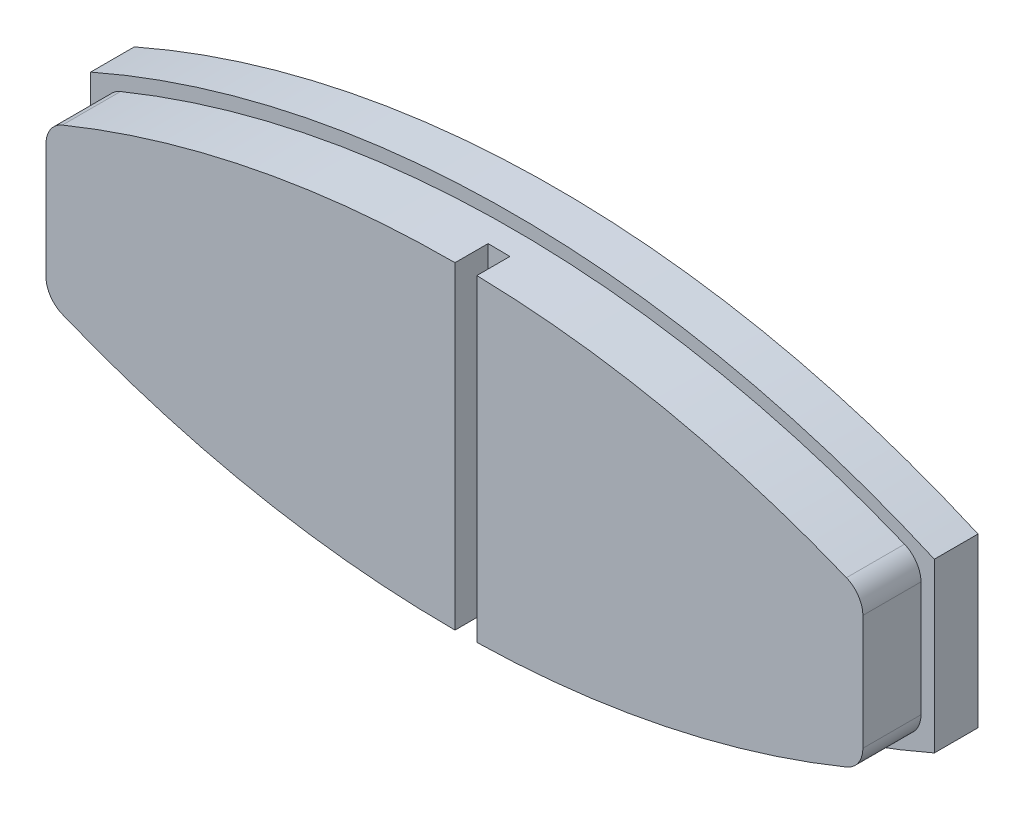
ISO-10303-21;
HEADER;
FILE_DESCRIPTION(('STEP AP214'),'2;1');
FILE_NAME('part.step','',(''),(''),'','','');
FILE_SCHEMA(('AUTOMOTIVE_DESIGN { 1 0 10303 214 1 1 1 1 }'));
ENDSEC;
DATA;
#1=APPLICATION_CONTEXT('core data for automotive mechanical design processes');
#2=APPLICATION_PROTOCOL_DEFINITION('international standard','automotive_design',2000,#1);
#3=PRODUCT_CONTEXT('',#1,'mechanical');
#4=PRODUCT('Part','Part','',(#3));
#5=PRODUCT_RELATED_PRODUCT_CATEGORY('part','',(#4));
#6=PRODUCT_DEFINITION_FORMATION('','',#4);
#7=PRODUCT_DEFINITION_CONTEXT('part definition',#1,'design');
#8=PRODUCT_DEFINITION('design','',#6,#7);
#9=PRODUCT_DEFINITION_SHAPE('','',#8);
#10=(LENGTH_UNIT() NAMED_UNIT(*) SI_UNIT(.MILLI.,.METRE.));
#11=(NAMED_UNIT(*) PLANE_ANGLE_UNIT() SI_UNIT($,.RADIAN.));
#12=(NAMED_UNIT(*) SI_UNIT($,.STERADIAN.) SOLID_ANGLE_UNIT());
#13=UNCERTAINTY_MEASURE_WITH_UNIT(LENGTH_MEASURE(1.E-05),#10,'distance_accuracy_value','');
#14=(GEOMETRIC_REPRESENTATION_CONTEXT(3) GLOBAL_UNCERTAINTY_ASSIGNED_CONTEXT((#13)) GLOBAL_UNIT_ASSIGNED_CONTEXT((#10,
#11,#12)) REPRESENTATION_CONTEXT('',''));
#15=CARTESIAN_POINT('',(0.,0.,0.));
#16=DIRECTION('',(0.,0.,1.));
#17=DIRECTION('',(1.,0.,0.));
#18=AXIS2_PLACEMENT_3D('',#15,#16,#17);
#19=CARTESIAN_POINT('',(0.,-66.2769013020833,7.6962));
#20=DIRECTION('',(0.,0.,1.));
#21=DIRECTION('',(1.,0.,0.));
#22=AXIS2_PLACEMENT_3D('',#19,#20,#21);
#23=PLANE('',#22);
#24=DIRECTION('',(0.,-1.,0.));
#25=VECTOR('',#24,1.);
#26=CARTESIAN_POINT('',(-30.90545,5.68369580839595,7.6962));
#27=LINE('',#26,#25);
#28=CARTESIAN_POINT('',(-30.90545,4.3537105548756,7.6962));
#29=VERTEX_POINT('',#28);
#30=CARTESIAN_POINT('',(-30.90545,-4.35371055487559,7.6962));
#31=VERTEX_POINT('',#30);
#32=EDGE_CURVE('E152',#29,#31,#27,.T.);
#33=ORIENTED_EDGE('',*,*,#32,.T.);
#34=CARTESIAN_POINT('',(-28.90545,-4.35371055487559,7.6962));
#35=DIRECTION('',(0.,0.,1.));
#36=DIRECTION('',(1.,0.,0.));
#37=AXIS2_PLACEMENT_3D('',#34,#35,#36);
#38=CIRCLE('',#37,2.);
#39=CARTESIAN_POINT('',(-29.66296507228,-6.20470242824206,7.6962));
#40=VERTEX_POINT('',#39);
#41=EDGE_CURVE('E247',#31,#40,#38,.T.);
#42=ORIENTED_EDGE('',*,*,#41,.T.);
#43=CARTESIAN_POINT('',(0.,66.2769013020833,7.6962));
#44=DIRECTION('',(0.,0.,1.));
#45=DIRECTION('',(1.,0.,0.));
#46=AXIS2_PLACEMENT_3D('',#43,#44,#45);
#47=CIRCLE('',#46,78.3165013020833);
#48=CARTESIAN_POINT('',(0.044450000000005,-12.0395873857832,7.6962));
#49=VERTEX_POINT('',#48);
#50=EDGE_CURVE('E194',#40,#49,#47,.T.);
#51=ORIENTED_EDGE('',*,*,#50,.T.);
#52=DIRECTION('',(0.,-1.,0.));
#53=VECTOR('',#52,1.);
#54=CARTESIAN_POINT('',(0.0444500000000116,-66.2769013020833,7.6962));
#55=LINE('',#54,#53);
#56=CARTESIAN_POINT('',(0.044450000000002,12.0395873857832,7.6962));
#57=VERTEX_POINT('',#56);
#58=EDGE_CURVE('E168',#57,#49,#55,.T.);
#59=ORIENTED_EDGE('',*,*,#58,.F.);
#60=CARTESIAN_POINT('',(0.,-66.2769013020833,7.6962));
#61=DIRECTION('',(0.,0.,1.));
#62=DIRECTION('',(1.,0.,0.));
#63=AXIS2_PLACEMENT_3D('',#60,#61,#62);
#64=CIRCLE('',#63,78.3165013020833);
#65=CARTESIAN_POINT('',(-29.6629650722799,6.20470242824206,7.6962));
#66=VERTEX_POINT('',#65);
#67=EDGE_CURVE('E157',#57,#66,#64,.T.);
#68=ORIENTED_EDGE('',*,*,#67,.T.);
#69=CARTESIAN_POINT('',(-28.90545,4.3537105548756,7.6962));
#70=DIRECTION('',(0.,0.,1.));
#71=DIRECTION('',(1.,0.,0.));
#72=AXIS2_PLACEMENT_3D('',#69,#70,#71);
#73=CIRCLE('',#72,2.);
#74=EDGE_CURVE('E244',#66,#29,#73,.T.);
#75=ORIENTED_EDGE('',*,*,#74,.T.);
#76=EDGE_LOOP('',(#33,#42,#51,#59,#68,#75));
#77=FACE_BOUND('',#76,.T.);
#78=ADVANCED_FACE('F54',(#77),#23,.T.);
#79=CARTESIAN_POINT('',(0.,-66.2769013020833,7.6962));
#80=DIRECTION('',(0.,0.,-1.));
#81=DIRECTION('',(-1.,0.,0.));
#82=AXIS2_PLACEMENT_3D('',#79,#80,#81);
#83=CYLINDRICAL_SURFACE('',#82,78.3165013020833);
#84=CARTESIAN_POINT('',(0.,-66.2769013020833,3.302));
#85=DIRECTION('',(0.,0.,1.));
#86=DIRECTION('',(1.,0.,0.));
#87=AXIS2_PLACEMENT_3D('',#84,#85,#86);
#88=CIRCLE('',#87,78.3165013020833);
#89=CARTESIAN_POINT('',(29.6629650722799,6.20470242824206,3.302));
#90=VERTEX_POINT('',#89);
#91=CARTESIAN_POINT('',(-29.6629650722799,6.20470242824206,3.302));
#92=VERTEX_POINT('',#91);
#93=EDGE_CURVE('E186',#90,#92,#88,.T.);
#94=ORIENTED_EDGE('',*,*,#93,.T.);
#95=DIRECTION('',(0.,0.,-1.));
#96=VECTOR('',#95,1.);
#97=CARTESIAN_POINT('',(-29.6629650722799,6.20470242824206,7.6962));
#98=LINE('',#97,#96);
#99=EDGE_CURVE('E251',#92,#66,#98,.F.);
#100=ORIENTED_EDGE('',*,*,#99,.T.);
#101=ORIENTED_EDGE('',*,*,#67,.F.);
#102=DIRECTION('',(0.,0.,-1.));
#103=VECTOR('',#102,1.);
#104=CARTESIAN_POINT('',(0.044450000000002,12.0395873857832,7.6962));
#105=LINE('',#104,#103);
#106=CARTESIAN_POINT('',(0.044450000000002,12.0395873857832,5.1962));
#107=VERTEX_POINT('',#106);
#108=EDGE_CURVE('E177',#57,#107,#105,.T.);
#109=ORIENTED_EDGE('',*,*,#108,.T.);
#110=CARTESIAN_POINT('',(0.,-66.2769013020833,5.1962));
#111=DIRECTION('',(0.,0.,1.));
#112=DIRECTION('',(1.,0.,0.));
#113=AXIS2_PLACEMENT_3D('',#110,#111,#112);
#114=CIRCLE('',#113,78.3165013020833);
#115=CARTESIAN_POINT('',(1.69545,12.0212457098142,5.1962));
#116=VERTEX_POINT('',#115);
#117=EDGE_CURVE('E173',#116,#107,#114,.T.);
#118=ORIENTED_EDGE('',*,*,#117,.F.);
#119=DIRECTION('',(0.,0.,-1.));
#120=VECTOR('',#119,1.);
#121=CARTESIAN_POINT('',(1.69545,12.0212457098142,7.6962));
#122=LINE('',#121,#120);
#123=CARTESIAN_POINT('',(1.69545,12.0212457098142,7.6962));
#124=VERTEX_POINT('',#123);
#125=EDGE_CURVE('E163',#116,#124,#122,.F.);
#126=ORIENTED_EDGE('',*,*,#125,.T.);
#127=CARTESIAN_POINT('',(29.6629650722799,6.20470242824206,7.6962));
#128=VERTEX_POINT('',#127);
#129=EDGE_CURVE('E144',#128,#124,#64,.T.);
#130=ORIENTED_EDGE('',*,*,#129,.F.);
#131=DIRECTION('',(0.,0.,-1.));
#132=VECTOR('',#131,1.);
#133=CARTESIAN_POINT('',(29.6629650722799,6.20470242824206,7.6962));
#134=LINE('',#133,#132);
#135=EDGE_CURVE('E252',#128,#90,#134,.T.);
#136=ORIENTED_EDGE('',*,*,#135,.T.);
#137=EDGE_LOOP('',(#94,#100,#101,#109,#118,#126,#130,#136));
#138=FACE_BOUND('',#137,.T.);
#139=ADVANCED_FACE('F171',(#138),#83,.T.);
#140=CARTESIAN_POINT('',(-30.90545,5.68369580839595,7.6962));
#141=DIRECTION('',(1.,0.,0.));
#142=DIRECTION('',(0.,1.,0.));
#143=AXIS2_PLACEMENT_3D('',#140,#141,#142);
#144=PLANE('',#143);
#145=DIRECTION('',(0.,-1.,0.));
#146=VECTOR('',#145,1.);
#147=CARTESIAN_POINT('',(-30.90545,5.68369580839595,3.302));
#148=LINE('',#147,#146);
#149=CARTESIAN_POINT('',(-30.90545,4.3537105548756,3.302));
#150=VERTEX_POINT('',#149);
#151=CARTESIAN_POINT('',(-30.90545,-4.35371055487559,3.302));
#152=VERTEX_POINT('',#151);
#153=EDGE_CURVE('E205',#150,#152,#148,.T.);
#154=ORIENTED_EDGE('',*,*,#153,.T.);
#155=DIRECTION('',(0.,0.,-1.));
#156=VECTOR('',#155,1.);
#157=CARTESIAN_POINT('',(-30.90545,-4.35371055487559,7.6962));
#158=LINE('',#157,#156);
#159=EDGE_CURVE('E245',#152,#31,#158,.F.);
#160=ORIENTED_EDGE('',*,*,#159,.T.);
#161=ORIENTED_EDGE('',*,*,#32,.F.);
#162=DIRECTION('',(0.,0.,-1.));
#163=VECTOR('',#162,1.);
#164=CARTESIAN_POINT('',(-30.90545,4.3537105548756,7.6962));
#165=LINE('',#164,#163);
#166=EDGE_CURVE('E238',#29,#150,#165,.T.);
#167=ORIENTED_EDGE('',*,*,#166,.T.);
#168=EDGE_LOOP('',(#154,#160,#161,#167));
#169=FACE_BOUND('',#168,.T.);
#170=ADVANCED_FACE('F288',(#169),#144,.F.);
#171=CARTESIAN_POINT('',(0.,66.2769013020833,7.6962));
#172=DIRECTION('',(0.,0.,-1.));
#173=DIRECTION('',(-1.,0.,0.));
#174=AXIS2_PLACEMENT_3D('',#171,#172,#173);
#175=CYLINDRICAL_SURFACE('',#174,78.3165013020833);
#176=ORIENTED_EDGE('',*,*,#50,.F.);
#177=DIRECTION('',(0.,0.,-1.));
#178=VECTOR('',#177,1.);
#179=CARTESIAN_POINT('',(-29.66296507228,-6.20470242824206,7.6962));
#180=LINE('',#179,#178);
#181=CARTESIAN_POINT('',(-29.66296507228,-6.20470242824206,3.302));
#182=VERTEX_POINT('',#181);
#183=EDGE_CURVE('E225',#40,#182,#180,.T.);
#184=ORIENTED_EDGE('',*,*,#183,.T.);
#185=CARTESIAN_POINT('',(0.,66.2769013020833,3.302));
#186=DIRECTION('',(0.,0.,1.));
#187=DIRECTION('',(1.,0.,0.));
#188=AXIS2_PLACEMENT_3D('',#185,#186,#187);
#189=CIRCLE('',#188,78.3165013020833);
#190=CARTESIAN_POINT('',(29.6629650722799,-6.20470242824206,3.302));
#191=VERTEX_POINT('',#190);
#192=EDGE_CURVE('E207',#182,#191,#189,.T.);
#193=ORIENTED_EDGE('',*,*,#192,.T.);
#194=DIRECTION('',(0.,0.,-1.));
#195=VECTOR('',#194,1.);
#196=CARTESIAN_POINT('',(29.6629650722799,-6.20470242824206,7.6962));
#197=LINE('',#196,#195);
#198=CARTESIAN_POINT('',(29.6629650722799,-6.20470242824206,7.6962));
#199=VERTEX_POINT('',#198);
#200=EDGE_CURVE('E218',#191,#199,#197,.F.);
#201=ORIENTED_EDGE('',*,*,#200,.T.);
#202=CARTESIAN_POINT('',(1.69545,-12.0212457098142,7.6962));
#203=VERTEX_POINT('',#202);
#204=EDGE_CURVE('E193',#203,#199,#47,.T.);
#205=ORIENTED_EDGE('',*,*,#204,.F.);
#206=DIRECTION('',(0.,0.,-1.));
#207=VECTOR('',#206,1.);
#208=CARTESIAN_POINT('',(1.69545,-12.0212457098142,7.6962));
#209=LINE('',#208,#207);
#210=CARTESIAN_POINT('',(1.69545,-12.0212457098142,5.1962));
#211=VERTEX_POINT('',#210);
#212=EDGE_CURVE('E165',#203,#211,#209,.T.);
#213=ORIENTED_EDGE('',*,*,#212,.T.);
#214=CARTESIAN_POINT('',(0.,66.2769013020833,5.1962));
#215=DIRECTION('',(0.,0.,1.));
#216=DIRECTION('',(1.,0.,0.));
#217=AXIS2_PLACEMENT_3D('',#214,#215,#216);
#218=CIRCLE('',#217,78.3165013020833);
#219=CARTESIAN_POINT('',(0.044450000000005,-12.0395873857832,5.1962));
#220=VERTEX_POINT('',#219);
#221=EDGE_CURVE('E219',#220,#211,#218,.T.);
#222=ORIENTED_EDGE('',*,*,#221,.F.);
#223=DIRECTION('',(0.,0.,-1.));
#224=VECTOR('',#223,1.);
#225=CARTESIAN_POINT('',(0.044450000000005,-12.0395873857832,7.6962));
#226=LINE('',#225,#224);
#227=EDGE_CURVE('E174',#220,#49,#226,.F.);
#228=ORIENTED_EDGE('',*,*,#227,.T.);
#229=EDGE_LOOP('',(#176,#184,#193,#201,#205,#213,#222,#228));
#230=FACE_BOUND('',#229,.T.);
#231=ADVANCED_FACE('F294',(#230),#175,.T.);
#232=CARTESIAN_POINT('',(30.90545,-5.68369580839595,7.6962));
#233=DIRECTION('',(-1.,0.,0.));
#234=DIRECTION('',(0.,0.,1.));
#235=AXIS2_PLACEMENT_3D('',#232,#233,#234);
#236=PLANE('',#235);
#237=DIRECTION('',(0.,1.,0.));
#238=VECTOR('',#237,1.);
#239=CARTESIAN_POINT('',(30.90545,-5.68369580839595,3.302));
#240=LINE('',#239,#238);
#241=CARTESIAN_POINT('',(30.90545,-4.35371055487559,3.302));
#242=VERTEX_POINT('',#241);
#243=CARTESIAN_POINT('',(30.90545,4.35371055487559,3.302));
#244=VERTEX_POINT('',#243);
#245=EDGE_CURVE('E208',#242,#244,#240,.T.);
#246=ORIENTED_EDGE('',*,*,#245,.T.);
#247=DIRECTION('',(0.,0.,-1.));
#248=VECTOR('',#247,1.);
#249=CARTESIAN_POINT('',(30.90545,4.35371055487559,7.6962));
#250=LINE('',#249,#248);
#251=CARTESIAN_POINT('',(30.90545,4.35371055487559,7.6962));
#252=VERTEX_POINT('',#251);
#253=EDGE_CURVE('E71',#244,#252,#250,.F.);
#254=ORIENTED_EDGE('',*,*,#253,.T.);
#255=DIRECTION('',(0.,1.,0.));
#256=VECTOR('',#255,1.);
#257=CARTESIAN_POINT('',(30.90545,-5.68369580839595,7.6962));
#258=LINE('',#257,#256);
#259=CARTESIAN_POINT('',(30.90545,-4.35371055487559,7.6962));
#260=VERTEX_POINT('',#259);
#261=EDGE_CURVE('E170',#260,#252,#258,.T.);
#262=ORIENTED_EDGE('',*,*,#261,.F.);
#263=DIRECTION('',(0.,0.,-1.));
#264=VECTOR('',#263,1.);
#265=CARTESIAN_POINT('',(30.90545,-4.35371055487559,7.6962));
#266=LINE('',#265,#264);
#267=EDGE_CURVE('E260',#260,#242,#266,.T.);
#268=ORIENTED_EDGE('',*,*,#267,.T.);
#269=EDGE_LOOP('',(#246,#254,#262,#268));
#270=FACE_BOUND('',#269,.T.);
#271=ADVANCED_FACE('F267',(#270),#236,.F.);
#272=ORIENTED_EDGE('',*,*,#261,.T.);
#273=CARTESIAN_POINT('',(28.90545,4.35371055487559,7.6962));
#274=DIRECTION('',(0.,0.,1.));
#275=DIRECTION('',(1.,0.,0.));
#276=AXIS2_PLACEMENT_3D('',#273,#274,#275);
#277=CIRCLE('',#276,2.);
#278=EDGE_CURVE('E12',#252,#128,#277,.T.);
#279=ORIENTED_EDGE('',*,*,#278,.T.);
#280=ORIENTED_EDGE('',*,*,#129,.T.);
#281=DIRECTION('',(0.,1.,0.));
#282=VECTOR('',#281,1.);
#283=CARTESIAN_POINT('',(1.69545000000001,-66.2769013020833,7.6962));
#284=LINE('',#283,#282);
#285=EDGE_CURVE('E150',#203,#124,#284,.T.);
#286=ORIENTED_EDGE('',*,*,#285,.F.);
#287=ORIENTED_EDGE('',*,*,#204,.T.);
#288=CARTESIAN_POINT('',(28.90545,-4.35371055487559,7.6962));
#289=DIRECTION('',(0.,0.,1.));
#290=DIRECTION('',(1.,0.,0.));
#291=AXIS2_PLACEMENT_3D('',#288,#289,#290);
#292=CIRCLE('',#291,2.);
#293=EDGE_CURVE('E63',#199,#260,#292,.T.);
#294=ORIENTED_EDGE('',*,*,#293,.T.);
#295=EDGE_LOOP('',(#272,#279,#280,#286,#287,#294));
#296=FACE_BOUND('',#295,.T.);
#297=ADVANCED_FACE('F146',(#296),#23,.T.);
#298=CARTESIAN_POINT('',(0.,-66.2769013020833,3.302));
#299=DIRECTION('',(0.,0.,1.));
#300=DIRECTION('',(1.,0.,0.));
#301=AXIS2_PLACEMENT_3D('',#298,#299,#300);
#302=PLANE('',#301);
#303=ORIENTED_EDGE('',*,*,#192,.F.);
#304=CARTESIAN_POINT('',(-28.90545,-4.35371055487559,3.302));
#305=DIRECTION('',(0.,0.,1.));
#306=DIRECTION('',(1.,0.,0.));
#307=AXIS2_PLACEMENT_3D('',#304,#305,#306);
#308=CIRCLE('',#307,2.);
#309=EDGE_CURVE('E232',#182,#152,#308,.F.);
#310=ORIENTED_EDGE('',*,*,#309,.T.);
#311=ORIENTED_EDGE('',*,*,#153,.F.);
#312=CARTESIAN_POINT('',(-28.90545,4.3537105548756,3.302));
#313=DIRECTION('',(0.,0.,1.));
#314=DIRECTION('',(1.,0.,0.));
#315=AXIS2_PLACEMENT_3D('',#312,#313,#314);
#316=CIRCLE('',#315,2.);
#317=EDGE_CURVE('E235',#150,#92,#316,.F.);
#318=ORIENTED_EDGE('',*,*,#317,.T.);
#319=ORIENTED_EDGE('',*,*,#93,.F.);
#320=CARTESIAN_POINT('',(28.90545,4.35371055487559,3.302));
#321=DIRECTION('',(0.,0.,1.));
#322=DIRECTION('',(1.,0.,0.));
#323=AXIS2_PLACEMENT_3D('',#320,#321,#322);
#324=CIRCLE('',#323,2.);
#325=EDGE_CURVE('E230',#90,#244,#324,.F.);
#326=ORIENTED_EDGE('',*,*,#325,.T.);
#327=ORIENTED_EDGE('',*,*,#245,.F.);
#328=CARTESIAN_POINT('',(28.90545,-4.35371055487559,3.302));
#329=DIRECTION('',(0.,0.,1.));
#330=DIRECTION('',(1.,0.,0.));
#331=AXIS2_PLACEMENT_3D('',#328,#329,#330);
#332=CIRCLE('',#331,2.);
#333=EDGE_CURVE('E228',#242,#191,#332,.F.);
#334=ORIENTED_EDGE('',*,*,#333,.T.);
#335=EDGE_LOOP('',(#303,#310,#311,#318,#319,#326,#327,#334));
#336=FACE_BOUND('',#335,.T.);
#337=ADVANCED_FACE('F275',(#336),#302,.F.);
#338=CARTESIAN_POINT('',(0.,0.,5.1962));
#339=DIRECTION('',(0.,0.,1.));
#340=DIRECTION('',(1.,0.,0.));
#341=AXIS2_PLACEMENT_3D('',#338,#339,#340);
#342=PLANE('',#341);
#343=ORIENTED_EDGE('',*,*,#117,.T.);
#344=DIRECTION('',(0.,-1.,0.));
#345=VECTOR('',#344,1.);
#346=CARTESIAN_POINT('',(0.0444500000000012,18.5167794108381,5.1962));
#347=LINE('',#346,#345);
#348=EDGE_CURVE('E301',#107,#220,#347,.T.);
#349=ORIENTED_EDGE('',*,*,#348,.T.);
#350=ORIENTED_EDGE('',*,*,#221,.T.);
#351=DIRECTION('',(0.,1.,0.));
#352=VECTOR('',#351,1.);
#353=CARTESIAN_POINT('',(1.69545,18.5167794108381,5.1962));
#354=LINE('',#353,#352);
#355=EDGE_CURVE('E185',#211,#116,#354,.T.);
#356=ORIENTED_EDGE('',*,*,#355,.T.);
#357=EDGE_LOOP('',(#343,#349,#350,#356));
#358=FACE_BOUND('',#357,.T.);
#359=ADVANCED_FACE('F303',(#358),#342,.T.);
#360=CARTESIAN_POINT('',(0.0444500000000012,18.5167794108381,5.1962));
#361=DIRECTION('',(-1.,0.,0.));
#362=DIRECTION('',(0.,-1.,0.));
#363=AXIS2_PLACEMENT_3D('',#360,#361,#362);
#364=PLANE('',#363);
#365=ORIENTED_EDGE('',*,*,#58,.T.);
#366=ORIENTED_EDGE('',*,*,#227,.F.);
#367=ORIENTED_EDGE('',*,*,#348,.F.);
#368=ORIENTED_EDGE('',*,*,#108,.F.);
#369=EDGE_LOOP('',(#365,#366,#367,#368));
#370=FACE_BOUND('',#369,.T.);
#371=ADVANCED_FACE('F297',(#370),#364,.F.);
#372=CARTESIAN_POINT('',(1.69545,18.5167794108381,5.1962));
#373=DIRECTION('',(1.,0.,0.));
#374=DIRECTION('',(0.,1.,0.));
#375=AXIS2_PLACEMENT_3D('',#372,#373,#374);
#376=PLANE('',#375);
#377=ORIENTED_EDGE('',*,*,#355,.F.);
#378=ORIENTED_EDGE('',*,*,#212,.F.);
#379=ORIENTED_EDGE('',*,*,#285,.T.);
#380=ORIENTED_EDGE('',*,*,#125,.F.);
#381=EDGE_LOOP('',(#377,#378,#379,#380));
#382=FACE_BOUND('',#381,.T.);
#383=ADVANCED_FACE('F156',(#382),#376,.F.);
#384=CARTESIAN_POINT('',(-28.90545,-4.35371055487559,7.6962));
#385=DIRECTION('',(0.,0.,-1.));
#386=DIRECTION('',(-1.,0.,0.));
#387=AXIS2_PLACEMENT_3D('',#384,#385,#386);
#388=CYLINDRICAL_SURFACE('',#387,2.);
#389=ORIENTED_EDGE('',*,*,#41,.F.);
#390=ORIENTED_EDGE('',*,*,#159,.F.);
#391=ORIENTED_EDGE('',*,*,#309,.F.);
#392=ORIENTED_EDGE('',*,*,#183,.F.);
#393=EDGE_LOOP('',(#389,#390,#391,#392));
#394=FACE_BOUND('',#393,.T.);
#395=ADVANCED_FACE('F292',(#394),#388,.T.);
#396=CARTESIAN_POINT('',(-28.90545,4.3537105548756,7.6962));
#397=DIRECTION('',(0.,0.,-1.));
#398=DIRECTION('',(-1.,0.,0.));
#399=AXIS2_PLACEMENT_3D('',#396,#397,#398);
#400=CYLINDRICAL_SURFACE('',#399,2.);
#401=ORIENTED_EDGE('',*,*,#74,.F.);
#402=ORIENTED_EDGE('',*,*,#99,.F.);
#403=ORIENTED_EDGE('',*,*,#317,.F.);
#404=ORIENTED_EDGE('',*,*,#166,.F.);
#405=EDGE_LOOP('',(#401,#402,#403,#404));
#406=FACE_BOUND('',#405,.T.);
#407=ADVANCED_FACE('F284',(#406),#400,.T.);
#408=CARTESIAN_POINT('',(28.90545,4.35371055487559,7.6962));
#409=DIRECTION('',(0.,0.,-1.));
#410=DIRECTION('',(-1.,0.,0.));
#411=AXIS2_PLACEMENT_3D('',#408,#409,#410);
#412=CYLINDRICAL_SURFACE('',#411,2.);
#413=ORIENTED_EDGE('',*,*,#278,.F.);
#414=ORIENTED_EDGE('',*,*,#253,.F.);
#415=ORIENTED_EDGE('',*,*,#325,.F.);
#416=ORIENTED_EDGE('',*,*,#135,.F.);
#417=EDGE_LOOP('',(#413,#414,#415,#416));
#418=FACE_BOUND('',#417,.T.);
#419=ADVANCED_FACE('F273',(#418),#412,.T.);
#420=CARTESIAN_POINT('',(28.90545,-4.35371055487559,7.6962));
#421=DIRECTION('',(0.,0.,-1.));
#422=DIRECTION('',(-1.,0.,0.));
#423=AXIS2_PLACEMENT_3D('',#420,#421,#422);
#424=CYLINDRICAL_SURFACE('',#423,2.);
#425=ORIENTED_EDGE('',*,*,#293,.F.);
#426=ORIENTED_EDGE('',*,*,#200,.F.);
#427=ORIENTED_EDGE('',*,*,#333,.F.);
#428=ORIENTED_EDGE('',*,*,#267,.F.);
#429=EDGE_LOOP('',(#425,#426,#427,#428));
#430=FACE_BOUND('',#429,.T.);
#431=ADVANCED_FACE('F60',(#430),#424,.T.);
#432=CLOSED_SHELL('',(#78,#139,#170,#231,#271,#297,#337,#359,#371,#383,#395,#407,#419,#431));
#433=MANIFOLD_SOLID_BREP('B2',#432);
#434=CARTESIAN_POINT('',(0.,-66.2769013020833,3.302));
#435=DIRECTION('',(0.,0.,-1.));
#436=DIRECTION('',(-1.,0.,0.));
#437=AXIS2_PLACEMENT_3D('',#434,#435,#436);
#438=CYLINDRICAL_SURFACE('',#437,79.3325013020833);
#439=CARTESIAN_POINT('',(0.,-66.2769013020833,0.));
#440=DIRECTION('',(0.,0.,1.));
#441=DIRECTION('',(1.,0.,0.));
#442=AXIS2_PLACEMENT_3D('',#439,#440,#441);
#443=CIRCLE('',#442,79.3325013020833);
#444=CARTESIAN_POINT('',(31.92145,6.35,0.));
#445=VERTEX_POINT('',#444);
#446=CARTESIAN_POINT('',(-31.92145,6.35,0.));
#447=VERTEX_POINT('',#446);
#448=EDGE_CURVE('E500',#445,#447,#443,.T.);
#449=ORIENTED_EDGE('',*,*,#448,.T.);
#450=DIRECTION('',(0.,0.,-1.));
#451=VECTOR('',#450,1.);
#452=CARTESIAN_POINT('',(-31.92145,6.35,3.302));
#453=LINE('',#452,#451);
#454=CARTESIAN_POINT('',(-31.92145,6.35,3.302));
#455=VERTEX_POINT('',#454);
#456=EDGE_CURVE('E52',#455,#447,#453,.T.);
#457=ORIENTED_EDGE('',*,*,#456,.F.);
#458=CARTESIAN_POINT('',(0.,-66.2769013020833,3.302));
#459=DIRECTION('',(0.,0.,1.));
#460=DIRECTION('',(1.,0.,0.));
#461=AXIS2_PLACEMENT_3D('',#458,#459,#460);
#462=CIRCLE('',#461,79.3325013020833);
#463=CARTESIAN_POINT('',(31.92145,6.35,3.302));
#464=VERTEX_POINT('',#463);
#465=EDGE_CURVE('E477',#464,#455,#462,.T.);
#466=ORIENTED_EDGE('',*,*,#465,.F.);
#467=DIRECTION('',(0.,0.,-1.));
#468=VECTOR('',#467,1.);
#469=CARTESIAN_POINT('',(31.92145,6.35,3.302));
#470=LINE('',#469,#468);
#471=EDGE_CURVE('E491',#464,#445,#470,.T.);
#472=ORIENTED_EDGE('',*,*,#471,.T.);
#473=EDGE_LOOP('',(#449,#457,#466,#472));
#474=FACE_BOUND('',#473,.T.);
#475=ADVANCED_FACE('F426',(#474),#438,.T.);
#476=CARTESIAN_POINT('',(-31.92145,6.35,3.302));
#477=DIRECTION('',(1.,0.,0.));
#478=DIRECTION('',(0.,0.,-1.));
#479=AXIS2_PLACEMENT_3D('',#476,#477,#478);
#480=PLANE('',#479);
#481=DIRECTION('',(0.,-1.,0.));
#482=VECTOR('',#481,1.);
#483=CARTESIAN_POINT('',(-31.92145,6.35,0.));
#484=LINE('',#483,#482);
#485=CARTESIAN_POINT('',(-31.92145,-6.35000000000001,0.));
#486=VERTEX_POINT('',#485);
#487=EDGE_CURVE('E481',#447,#486,#484,.T.);
#488=ORIENTED_EDGE('',*,*,#487,.T.);
#489=DIRECTION('',(0.,0.,-1.));
#490=VECTOR('',#489,1.);
#491=CARTESIAN_POINT('',(-31.92145,-6.35000000000001,3.302));
#492=LINE('',#491,#490);
#493=CARTESIAN_POINT('',(-31.92145,-6.35000000000001,3.302));
#494=VERTEX_POINT('',#493);
#495=EDGE_CURVE('E440',#494,#486,#492,.T.);
#496=ORIENTED_EDGE('',*,*,#495,.F.);
#497=DIRECTION('',(0.,-1.,0.));
#498=VECTOR('',#497,1.);
#499=CARTESIAN_POINT('',(-31.92145,6.35,3.302));
#500=LINE('',#499,#498);
#501=EDGE_CURVE('E474',#455,#494,#500,.T.);
#502=ORIENTED_EDGE('',*,*,#501,.F.);
#503=ORIENTED_EDGE('',*,*,#456,.T.);
#504=EDGE_LOOP('',(#488,#496,#502,#503));
#505=FACE_BOUND('',#504,.T.);
#506=ADVANCED_FACE('F484',(#505),#480,.F.);
#507=CARTESIAN_POINT('',(0.,66.2769013020833,3.302));
#508=DIRECTION('',(0.,0.,-1.));
#509=DIRECTION('',(-1.,0.,0.));
#510=AXIS2_PLACEMENT_3D('',#507,#508,#509);
#511=CYLINDRICAL_SURFACE('',#510,79.3325013020833);
#512=CARTESIAN_POINT('',(0.,66.2769013020833,0.));
#513=DIRECTION('',(0.,0.,1.));
#514=DIRECTION('',(-1.,0.,0.));
#515=AXIS2_PLACEMENT_3D('',#512,#513,#514);
#516=CIRCLE('',#515,79.3325013020833);
#517=CARTESIAN_POINT('',(31.92145,-6.35,0.));
#518=VERTEX_POINT('',#517);
#519=EDGE_CURVE('E465',#486,#518,#516,.T.);
#520=ORIENTED_EDGE('',*,*,#519,.T.);
#521=DIRECTION('',(0.,0.,-1.));
#522=VECTOR('',#521,1.);
#523=CARTESIAN_POINT('',(31.92145,-6.35,3.302));
#524=LINE('',#523,#522);
#525=CARTESIAN_POINT('',(31.92145,-6.35,3.302));
#526=VERTEX_POINT('',#525);
#527=EDGE_CURVE('E487',#526,#518,#524,.T.);
#528=ORIENTED_EDGE('',*,*,#527,.F.);
#529=CARTESIAN_POINT('',(0.,66.2769013020833,3.302));
#530=DIRECTION('',(0.,0.,1.));
#531=DIRECTION('',(-1.,0.,0.));
#532=AXIS2_PLACEMENT_3D('',#529,#530,#531);
#533=CIRCLE('',#532,79.3325013020833);
#534=EDGE_CURVE('E480',#494,#526,#533,.T.);
#535=ORIENTED_EDGE('',*,*,#534,.F.);
#536=ORIENTED_EDGE('',*,*,#495,.T.);
#537=EDGE_LOOP('',(#520,#528,#535,#536));
#538=FACE_BOUND('',#537,.T.);
#539=ADVANCED_FACE('F486',(#538),#511,.T.);
#540=CARTESIAN_POINT('',(31.92145,6.35,3.302));
#541=DIRECTION('',(-1.,0.,0.));
#542=DIRECTION('',(0.,0.,1.));
#543=AXIS2_PLACEMENT_3D('',#540,#541,#542);
#544=PLANE('',#543);
#545=DIRECTION('',(0.,1.,0.));
#546=VECTOR('',#545,1.);
#547=CARTESIAN_POINT('',(31.92145,6.35,0.));
#548=LINE('',#547,#546);
#549=EDGE_CURVE('E466',#518,#445,#548,.T.);
#550=ORIENTED_EDGE('',*,*,#549,.T.);
#551=ORIENTED_EDGE('',*,*,#471,.F.);
#552=DIRECTION('',(0.,1.,0.));
#553=VECTOR('',#552,1.);
#554=CARTESIAN_POINT('',(31.92145,6.35,3.302));
#555=LINE('',#554,#553);
#556=EDGE_CURVE('E444',#526,#464,#555,.T.);
#557=ORIENTED_EDGE('',*,*,#556,.F.);
#558=ORIENTED_EDGE('',*,*,#527,.T.);
#559=EDGE_LOOP('',(#550,#551,#557,#558));
#560=FACE_BOUND('',#559,.T.);
#561=ADVANCED_FACE('F512',(#560),#544,.F.);
#562=CARTESIAN_POINT('',(0.,-66.2769013020833,3.302));
#563=DIRECTION('',(0.,0.,1.));
#564=DIRECTION('',(1.,0.,0.));
#565=AXIS2_PLACEMENT_3D('',#562,#563,#564);
#566=PLANE('',#565);
#567=CARTESIAN_POINT('',(-23.8125,0.,3.302));
#568=DIRECTION('',(0.,0.,1.));
#569=DIRECTION('',(1.,0.,0.));
#570=AXIS2_PLACEMENT_3D('',#567,#568,#569);
#571=CIRCLE('',#570,3.35);
#572=CARTESIAN_POINT('',(-20.4625,0.,3.302));
#573=VERTEX_POINT('',#572);
#574=EDGE_CURVE('E526',#573,#573,#571,.T.);
#575=ORIENTED_EDGE('',*,*,#574,.F.);
#576=EDGE_LOOP('',(#575));
#577=FACE_BOUND('',#576,.T.);
#578=CARTESIAN_POINT('',(23.8125,0.,3.302));
#579=DIRECTION('',(0.,0.,1.));
#580=DIRECTION('',(1.,0.,0.));
#581=AXIS2_PLACEMENT_3D('',#578,#579,#580);
#582=CIRCLE('',#581,3.35);
#583=CARTESIAN_POINT('',(27.1625,0.,3.302));
#584=VERTEX_POINT('',#583);
#585=EDGE_CURVE('E501',#584,#584,#582,.T.);
#586=ORIENTED_EDGE('',*,*,#585,.F.);
#587=EDGE_LOOP('',(#586));
#588=FACE_BOUND('',#587,.T.);
#589=ORIENTED_EDGE('',*,*,#465,.T.);
#590=ORIENTED_EDGE('',*,*,#501,.T.);
#591=ORIENTED_EDGE('',*,*,#534,.T.);
#592=ORIENTED_EDGE('',*,*,#556,.T.);
#593=EDGE_LOOP('',(#589,#590,#591,#592));
#594=FACE_BOUND('',#593,.T.);
#595=ADVANCED_FACE('F479',(#577,#588,#594),#566,.T.);
#596=CARTESIAN_POINT('',(0.,-66.2769013020833,0.));
#597=DIRECTION('',(0.,0.,1.));
#598=DIRECTION('',(1.,0.,0.));
#599=AXIS2_PLACEMENT_3D('',#596,#597,#598);
#600=PLANE('',#599);
#601=CARTESIAN_POINT('',(-23.8125,0.,0.));
#602=DIRECTION('',(0.,0.,-1.));
#603=DIRECTION('',(1.,0.,0.));
#604=AXIS2_PLACEMENT_3D('',#601,#602,#603);
#605=CIRCLE('',#604,3.35);
#606=CARTESIAN_POINT('',(-20.4625,0.,0.));
#607=VERTEX_POINT('',#606);
#608=EDGE_CURVE('E527',#607,#607,#605,.T.);
#609=ORIENTED_EDGE('',*,*,#608,.F.);
#610=EDGE_LOOP('',(#609));
#611=FACE_BOUND('',#610,.T.);
#612=CARTESIAN_POINT('',(23.8125,0.,0.));
#613=DIRECTION('',(0.,0.,-1.));
#614=DIRECTION('',(-1.,0.,0.));
#615=AXIS2_PLACEMENT_3D('',#612,#613,#614);
#616=CIRCLE('',#615,3.35);
#617=CARTESIAN_POINT('',(20.4625,0.,0.));
#618=VERTEX_POINT('',#617);
#619=EDGE_CURVE('E522',#618,#618,#616,.T.);
#620=ORIENTED_EDGE('',*,*,#619,.F.);
#621=EDGE_LOOP('',(#620));
#622=FACE_BOUND('',#621,.T.);
#623=ORIENTED_EDGE('',*,*,#448,.F.);
#624=ORIENTED_EDGE('',*,*,#549,.F.);
#625=ORIENTED_EDGE('',*,*,#519,.F.);
#626=ORIENTED_EDGE('',*,*,#487,.F.);
#627=EDGE_LOOP('',(#623,#624,#625,#626));
#628=FACE_BOUND('',#627,.T.);
#629=ADVANCED_FACE('F511',(#611,#622,#628),#600,.F.);
#630=CARTESIAN_POINT('',(23.8125,0.,6.35));
#631=DIRECTION('',(0.,0.,-1.));
#632=DIRECTION('',(-1.,0.,0.));
#633=AXIS2_PLACEMENT_3D('',#630,#631,#632);
#634=CYLINDRICAL_SURFACE('',#633,3.35);
#635=ORIENTED_EDGE('',*,*,#585,.T.);
#636=EDGE_LOOP('',(#635));
#637=FACE_BOUND('',#636,.T.);
#638=ORIENTED_EDGE('',*,*,#619,.T.);
#639=EDGE_LOOP('',(#638));
#640=FACE_BOUND('',#639,.T.);
#641=ADVANCED_FACE('F540',(#637,#640),#634,.F.);
#642=CARTESIAN_POINT('',(-23.8125,0.,6.35));
#643=DIRECTION('',(0.,0.,-1.));
#644=DIRECTION('',(-1.,0.,0.));
#645=AXIS2_PLACEMENT_3D('',#642,#643,#644);
#646=CYLINDRICAL_SURFACE('',#645,3.35);
#647=ORIENTED_EDGE('',*,*,#574,.T.);
#648=EDGE_LOOP('',(#647));
#649=FACE_BOUND('',#648,.T.);
#650=ORIENTED_EDGE('',*,*,#608,.T.);
#651=EDGE_LOOP('',(#650));
#652=FACE_BOUND('',#651,.T.);
#653=ADVANCED_FACE('F531',(#649,#652),#646,.F.);
#654=CLOSED_SHELL('',(#475,#506,#539,#561,#595,#629,#641,#653));
#655=MANIFOLD_SOLID_BREP('B6',#654);
#656=ADVANCED_BREP_SHAPE_REPRESENTATION('',(#18,#433,#655),#14);
#657=SHAPE_DEFINITION_REPRESENTATION(#9,#656);
ENDSEC;
END-ISO-10303-21;
